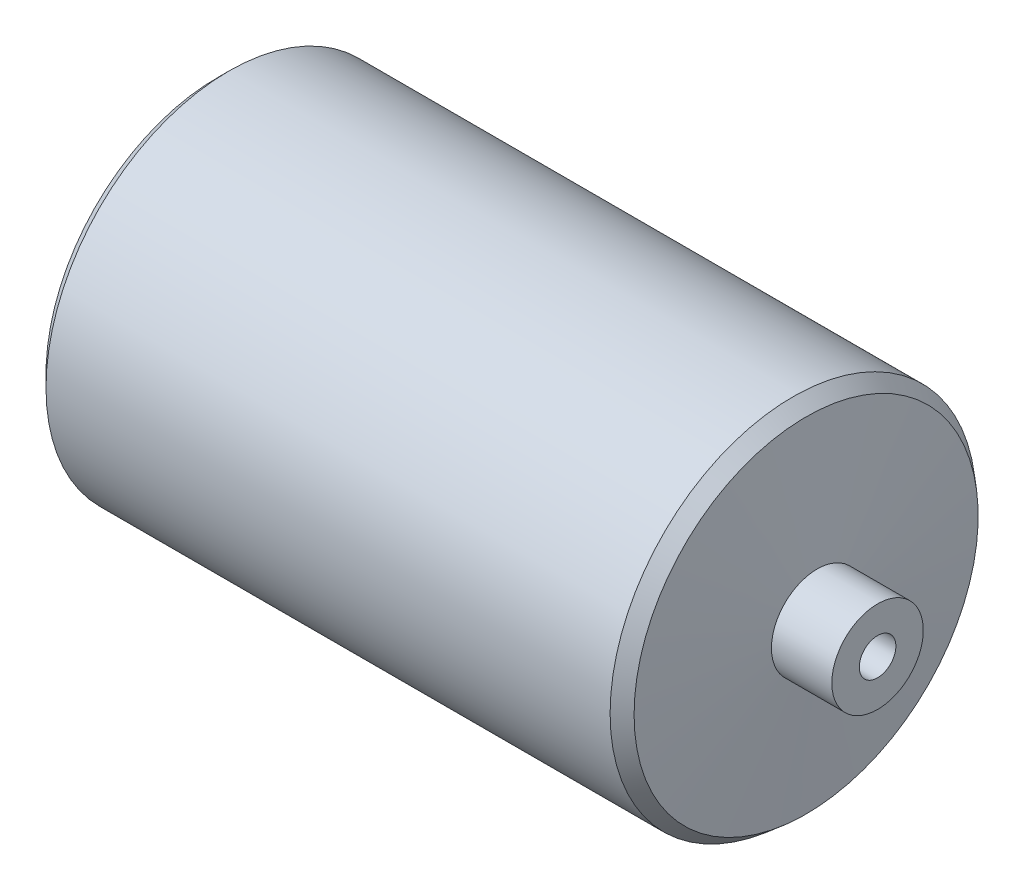
ISO-10303-21;
HEADER;
FILE_DESCRIPTION(('STEP AP214'),'2;1');
FILE_NAME('part.step','',(''),(''),'','','');
FILE_SCHEMA(('AUTOMOTIVE_DESIGN { 1 0 10303 214 1 1 1 1 }'));
ENDSEC;
DATA;
#1=APPLICATION_CONTEXT('core data for automotive mechanical design processes');
#2=APPLICATION_PROTOCOL_DEFINITION('international standard','automotive_design',2000,#1);
#3=PRODUCT_CONTEXT('',#1,'mechanical');
#4=PRODUCT('Part','Part','',(#3));
#5=PRODUCT_RELATED_PRODUCT_CATEGORY('part','',(#4));
#6=PRODUCT_DEFINITION_FORMATION('','',#4);
#7=PRODUCT_DEFINITION_CONTEXT('part definition',#1,'design');
#8=PRODUCT_DEFINITION('design','',#6,#7);
#9=PRODUCT_DEFINITION_SHAPE('','',#8);
#10=(LENGTH_UNIT() NAMED_UNIT(*) SI_UNIT(.MILLI.,.METRE.));
#11=(NAMED_UNIT(*) PLANE_ANGLE_UNIT() SI_UNIT($,.RADIAN.));
#12=(NAMED_UNIT(*) SI_UNIT($,.STERADIAN.) SOLID_ANGLE_UNIT());
#13=UNCERTAINTY_MEASURE_WITH_UNIT(LENGTH_MEASURE(1.E-05),#10,'distance_accuracy_value','');
#14=(GEOMETRIC_REPRESENTATION_CONTEXT(3) GLOBAL_UNCERTAINTY_ASSIGNED_CONTEXT((#13)) GLOBAL_UNIT_ASSIGNED_CONTEXT((#10,
#11,#12)) REPRESENTATION_CONTEXT('',''));
#15=CARTESIAN_POINT('',(0.,0.,0.));
#16=DIRECTION('',(0.,0.,1.));
#17=DIRECTION('',(1.,0.,0.));
#18=AXIS2_PLACEMENT_3D('',#15,#16,#17);
#19=CARTESIAN_POINT('',(-96.0960960960961,40.8408408408408,0.));
#20=DIRECTION('',(1.,0.,0.));
#21=DIRECTION('',(0.,0.,-1.));
#22=AXIS2_PLACEMENT_3D('',#19,#20,#21);
#23=PLANE('',#22);
#24=CARTESIAN_POINT('',(-96.0960960960961,28.3408408408408,0.));
#25=DIRECTION('',(-1.,0.,0.));
#26=DIRECTION('',(0.,0.,1.));
#27=AXIS2_PLACEMENT_3D('',#24,#25,#26);
#28=CIRCLE('',#27,4.99999999999999);
#29=CARTESIAN_POINT('',(-96.0960960960961,28.3408408408408,4.99999999999999));
#30=VERTEX_POINT('',#29);
#31=EDGE_CURVE('E71',#30,#30,#28,.T.);
#32=ORIENTED_EDGE('',*,*,#31,.F.);
#33=EDGE_LOOP('',(#32));
#34=FACE_BOUND('',#33,.T.);
#35=CARTESIAN_POINT('',(-96.0960960960961,28.3408408408408,0.));
#36=DIRECTION('',(-1.,0.,0.));
#37=DIRECTION('',(0.,0.,1.));
#38=AXIS2_PLACEMENT_3D('',#35,#36,#37);
#39=CIRCLE('',#38,12.5);
#40=CARTESIAN_POINT('',(-96.0960960960961,28.3408408408408,12.5));
#41=VERTEX_POINT('',#40);
#42=EDGE_CURVE('E81',#41,#41,#39,.T.);
#43=ORIENTED_EDGE('',*,*,#42,.T.);
#44=EDGE_LOOP('',(#43));
#45=FACE_BOUND('',#44,.T.);
#46=ADVANCED_FACE('F45',(#34,#45),#23,.F.);
#47=CARTESIAN_POINT('',(103.903903903904,28.3408408408408,0.));
#48=DIRECTION('',(-1.,0.,0.));
#49=DIRECTION('',(0.,0.,1.));
#50=AXIS2_PLACEMENT_3D('',#47,#48,#49);
#51=PLANE('',#50);
#52=CARTESIAN_POINT('',(103.903903903904,28.3408408408408,0.));
#53=DIRECTION('',(1.,0.,0.));
#54=DIRECTION('',(0.,0.,-1.));
#55=AXIS2_PLACEMENT_3D('',#52,#53,#54);
#56=CIRCLE('',#55,4.99999999999999);
#57=CARTESIAN_POINT('',(103.903903903904,28.3408408408408,-4.99999999999999));
#58=VERTEX_POINT('',#57);
#59=EDGE_CURVE('E70',#58,#58,#56,.T.);
#60=ORIENTED_EDGE('',*,*,#59,.F.);
#61=EDGE_LOOP('',(#60));
#62=FACE_BOUND('',#61,.T.);
#63=CARTESIAN_POINT('',(103.903903903904,28.3408408408408,0.));
#64=DIRECTION('',(-1.,0.,0.));
#65=DIRECTION('',(0.,0.,1.));
#66=AXIS2_PLACEMENT_3D('',#63,#64,#65);
#67=CIRCLE('',#66,12.5);
#68=CARTESIAN_POINT('',(103.903903903904,28.3408408408408,12.5));
#69=VERTEX_POINT('',#68);
#70=EDGE_CURVE('E90',#69,#69,#67,.T.);
#71=ORIENTED_EDGE('',*,*,#70,.F.);
#72=EDGE_LOOP('',(#71));
#73=FACE_BOUND('',#72,.T.);
#74=ADVANCED_FACE('F137',(#62,#73),#51,.F.);
#75=CARTESIAN_POINT('',(-96.0960960960961,28.3408408408408,0.));
#76=DIRECTION('',(-1.,0.,0.));
#77=DIRECTION('',(0.,0.,1.));
#78=AXIS2_PLACEMENT_3D('',#75,#76,#77);
#79=CYLINDRICAL_SURFACE('',#78,12.5);
#80=CARTESIAN_POINT('',(87.4039039039039,28.3408408408408,0.));
#81=DIRECTION('',(-1.,0.,0.));
#82=DIRECTION('',(0.,0.,1.));
#83=AXIS2_PLACEMENT_3D('',#80,#81,#82);
#84=CIRCLE('',#83,12.5);
#85=CARTESIAN_POINT('',(87.4039039039039,28.3408408408408,12.4999999999999));
#86=VERTEX_POINT('',#85);
#87=EDGE_CURVE('E87',#86,#86,#84,.T.);
#88=ORIENTED_EDGE('',*,*,#87,.F.);
#89=EDGE_LOOP('',(#88));
#90=FACE_BOUND('',#89,.T.);
#91=ORIENTED_EDGE('',*,*,#70,.T.);
#92=EDGE_LOOP('',(#91));
#93=FACE_BOUND('',#92,.T.);
#94=ADVANCED_FACE('F144',(#90,#93),#79,.T.);
#95=CARTESIAN_POINT('',(87.4039039039039,28.3408408408408,0.));
#96=DIRECTION('',(-1.,0.,0.));
#97=DIRECTION('',(0.,0.,1.));
#98=AXIS2_PLACEMENT_3D('',#95,#96,#97);
#99=CONICAL_SURFACE('',#98,12.5,1.48352986419518);
#100=CARTESIAN_POINT('',(84.3845462499247,28.3408408408408,0.));
#101=DIRECTION('',(1.,0.,0.));
#102=DIRECTION('',(0.,0.,-1.));
#103=AXIS2_PLACEMENT_3D('',#100,#101,#102);
#104=CIRCLE('',#103,47.0114159057247);
#105=CARTESIAN_POINT('',(84.3845462499247,28.3408408408408,47.0114159057248));
#106=VERTEX_POINT('',#105);
#107=EDGE_CURVE('E54',#106,#106,#104,.T.);
#108=CARTESIAN_POINT('',(84.3845462499247,28.3408408408408,47.0114159057248));
#109=CARTESIAN_POINT('',(84.4159978921536,28.3408408408408,46.6519219900402));
#110=CARTESIAN_POINT('',(84.4474495343826,28.3408408408408,46.2924280743556));
#111=CARTESIAN_POINT('',(84.5103528188405,28.3408408408408,45.5734402429863));
#112=CARTESIAN_POINT('',(84.5418044610694,28.3408408408408,45.2139463273017));
#113=CARTESIAN_POINT('',(84.6047077455273,28.3408408408408,44.4949584959324));
#114=CARTESIAN_POINT('',(84.6361593877563,28.3408408408408,44.1354645802478));
#115=CARTESIAN_POINT('',(84.6990626722142,28.3408408408408,43.4164767488785));
#116=CARTESIAN_POINT('',(84.7305143144431,28.3408408408408,43.0569828331939));
#117=CARTESIAN_POINT('',(84.793417598901,28.3408408408408,42.3379950018246));
#118=CARTESIAN_POINT('',(84.82486924113,28.3408408408408,41.97850108614));
#119=CARTESIAN_POINT('',(84.8877725255879,28.3408408408408,41.2595132547707));
#120=CARTESIAN_POINT('',(84.9192241678169,28.3408408408408,40.9000193390861));
#121=CARTESIAN_POINT('',(84.9821274522748,28.3408408408408,40.1810315077168));
#122=CARTESIAN_POINT('',(85.0135790945037,28.3408408408408,39.8215375920322));
#123=CARTESIAN_POINT('',(85.0764823789616,28.3408408408408,39.1025497606629));
#124=CARTESIAN_POINT('',(85.1079340211905,28.3408408408408,38.7430558449783));
#125=CARTESIAN_POINT('',(85.1708373056484,28.3408408408408,38.024068013609));
#126=CARTESIAN_POINT('',(85.2022889478774,28.3408408408408,37.6645740979244));
#127=CARTESIAN_POINT('',(85.2651922323353,28.3408408408408,36.9455862665551));
#128=CARTESIAN_POINT('',(85.2966438745642,28.3408408408408,36.5860923508705));
#129=CARTESIAN_POINT('',(85.3595471590222,28.3408408408408,35.8671045195012));
#130=CARTESIAN_POINT('',(85.3909988012511,28.3408408408408,35.5076106038165));
#131=CARTESIAN_POINT('',(85.453902085709,28.3408408408408,34.7886227724473));
#132=CARTESIAN_POINT('',(85.4853537279379,28.3408408408408,34.4291288567626));
#133=CARTESIAN_POINT('',(85.5482570123959,28.3408408408408,33.7101410253934));
#134=CARTESIAN_POINT('',(85.5797086546248,28.3408408408408,33.3506471097087));
#135=CARTESIAN_POINT('',(85.6426119390827,28.3408408408408,32.6316592783395));
#136=CARTESIAN_POINT('',(85.6740635813116,28.3408408408408,32.2721653626548));
#137=CARTESIAN_POINT('',(85.7369668657695,28.3408408408408,31.5531775312856));
#138=CARTESIAN_POINT('',(85.7684185079985,28.3408408408408,31.1936836156009));
#139=CARTESIAN_POINT('',(85.8313217924564,28.3408408408408,30.4746957842317));
#140=CARTESIAN_POINT('',(85.8627734346854,28.3408408408408,30.115201868547));
#141=CARTESIAN_POINT('',(85.9256767191433,28.3408408408408,29.3962140371778));
#142=CARTESIAN_POINT('',(85.9571283613722,28.3408408408408,29.0367201214931));
#143=CARTESIAN_POINT('',(86.0200316458301,28.3408408408408,28.3177322901239));
#144=CARTESIAN_POINT('',(86.0514832880591,28.3408408408408,27.9582383744392));
#145=CARTESIAN_POINT('',(86.114386572517,28.3408408408408,27.23925054307));
#146=CARTESIAN_POINT('',(86.1458382147459,28.3408408408408,26.8797566273853));
#147=CARTESIAN_POINT('',(86.2087414992038,28.3408408408408,26.1607687960161));
#148=CARTESIAN_POINT('',(86.2401931414328,28.3408408408408,25.8012748803314));
#149=CARTESIAN_POINT('',(86.3030964258907,28.3408408408408,25.0822870489621));
#150=CARTESIAN_POINT('',(86.3345480681196,28.3408408408408,24.7227931332775));
#151=CARTESIAN_POINT('',(86.3974513525775,28.3408408408408,24.0038053019082));
#152=CARTESIAN_POINT('',(86.4289029948065,28.3408408408408,23.6443113862236));
#153=CARTESIAN_POINT('',(86.4918062792644,28.3408408408408,22.9253235548543));
#154=CARTESIAN_POINT('',(86.5232579214933,28.3408408408408,22.5658296391697));
#155=CARTESIAN_POINT('',(86.5861612059512,28.3408408408408,21.8468418078004));
#156=CARTESIAN_POINT('',(86.6176128481802,28.3408408408408,21.4873478921158));
#157=CARTESIAN_POINT('',(86.6805161326381,28.3408408408408,20.7683600607465));
#158=CARTESIAN_POINT('',(86.711967774867,28.3408408408408,20.4088661450619));
#159=CARTESIAN_POINT('',(86.7748710593249,28.3408408408408,19.6898783136926));
#160=CARTESIAN_POINT('',(86.8063227015539,28.3408408408408,19.330384398008));
#161=CARTESIAN_POINT('',(86.8692259860118,28.3408408408408,18.6113965666387));
#162=CARTESIAN_POINT('',(86.9006776282407,28.3408408408408,18.2519026509541));
#163=CARTESIAN_POINT('',(86.9635809126986,28.3408408408408,17.5329148195848));
#164=CARTESIAN_POINT('',(86.9950325549276,28.3408408408408,17.1734209039002));
#165=CARTESIAN_POINT('',(87.0579358393855,28.3408408408408,16.4544330725309));
#166=CARTESIAN_POINT('',(87.0893874816144,28.3408408408408,16.0949391568463));
#167=CARTESIAN_POINT('',(87.1522907660723,28.3408408408408,15.375951325477));
#168=CARTESIAN_POINT('',(87.1837424083013,28.3408408408408,15.0164574097924));
#169=CARTESIAN_POINT('',(87.2466456927592,28.3408408408408,14.2974695784231));
#170=CARTESIAN_POINT('',(87.2780973349881,28.3408408408408,13.9379756627385));
#171=CARTESIAN_POINT('',(87.341000619446,28.3408408408408,13.2189878313692));
#172=CARTESIAN_POINT('',(87.372452261675,28.3408408408408,12.8594939156846));
#173=CARTESIAN_POINT('',(87.4039039039039,28.3408408408408,12.4999999999999));
#174=B_SPLINE_CURVE_WITH_KNOTS('',3,(#108,#109,#110,#111,#112,#113,#114,#115,#116,#117,#118,
#119,#120,#121,#122,#123,#124,#125,#126,#127,#128,#129,#130,#131,#132,#133,#134,#135,#136,#137,
#138,#139,#140,#141,#142,#143,#144,#145,#146,#147,#148,#149,#150,#151,#152,#153,#154,#155,#156,
#157,#158,#159,#160,#161,#162,#163,#164,#165,#166,#167,#168,#169,#170,#171,#172,#173),
.UNSPECIFIED.,.F.,.F.,(4,2,2,2,2,2,2,2,2,2,2,2,2,2,2,2,2,2,2,2,2,2,2,2,2,2,2,2,2,2,2,2,4),(0.,
1.08260137212111,2.16520274424222,3.24780411636334,4.33040548848446,5.41300686060557,
6.49560823272669,7.5782096048478,8.66081097696891,9.74341234909003,10.8260137212111,
11.9086150933323,12.9912164654534,14.0738178375745,15.1564192096956,16.2390205818167,
17.3216219539378,18.4042233260589,19.4868246981801,20.5694260703012,21.6520274424223,
22.7346288145434,23.8172301866645,24.8998315587856,25.9824329309068,27.0650343030279,
28.147635675149,29.2302370472701,30.3128384193912,31.3954397915123,32.4780411636334,
33.5606425357546,34.6432439078757),.UNSPECIFIED.);
#175=EDGE_CURVE('BSEAM101',#106,#86,#174,.T.);
#176=ORIENTED_EDGE('',*,*,#107,.T.);
#177=ORIENTED_EDGE('',*,*,#87,.T.);
#178=ORIENTED_EDGE('',*,*,#175,.T.);
#179=ORIENTED_EDGE('',*,*,#175,.F.);
#180=EDGE_LOOP('',(#176,#178,#177,#179));
#181=FACE_BOUND('',#180,.T.);
#182=ADVANCED_FACE('F101',(#181),#99,.T.);
#183=CARTESIAN_POINT('',(-96.0960960960961,28.3408408408408,0.));
#184=DIRECTION('',(-1.,0.,0.));
#185=DIRECTION('',(0.,0.,1.));
#186=AXIS2_PLACEMENT_3D('',#183,#184,#185);
#187=CYLINDRICAL_SURFACE('',#186,50.);
#188=CARTESIAN_POINT('',(80.8228904188022,28.3408408408408,0.));
#189=DIRECTION('',(-1.,0.,0.));
#190=DIRECTION('',(0.,0.,1.));
#191=AXIS2_PLACEMENT_3D('',#188,#189,#190);
#192=CIRCLE('',#191,50.);
#193=CARTESIAN_POINT('',(80.8228904188022,28.3408408408408,50.));
#194=VERTEX_POINT('',#193);
#195=EDGE_CURVE('E96',#194,#194,#192,.T.);
#196=ORIENTED_EDGE('',*,*,#195,.T.);
#197=EDGE_LOOP('',(#196));
#198=FACE_BOUND('',#197,.T.);
#199=CARTESIAN_POINT('',(-73.3152712138738,28.3408408408408,0.));
#200=DIRECTION('',(1.,0.,0.));
#201=DIRECTION('',(0.,0.,-1.));
#202=AXIS2_PLACEMENT_3D('',#199,#200,#201);
#203=CIRCLE('',#202,50.);
#204=CARTESIAN_POINT('',(-73.3152712138738,28.3408408408408,-50.));
#205=VERTEX_POINT('',#204);
#206=EDGE_CURVE('E93',#205,#205,#203,.T.);
#207=ORIENTED_EDGE('',*,*,#206,.T.);
#208=EDGE_LOOP('',(#207));
#209=FACE_BOUND('',#208,.T.);
#210=ADVANCED_FACE('F110',(#198,#209),#187,.T.);
#211=CARTESIAN_POINT('',(-76.3152712138738,28.3408408408408,0.));
#212=DIRECTION('',(1.,0.,0.));
#213=DIRECTION('',(0.,0.,-1.));
#214=AXIS2_PLACEMENT_3D('',#211,#212,#213);
#215=CONICAL_SURFACE('',#214,50.,1.48352986419518);
#216=CARTESIAN_POINT('',(-76.6029016027651,28.3408408408408,0.));
#217=DIRECTION('',(-1.,0.,0.));
#218=DIRECTION('',(0.,0.,1.));
#219=AXIS2_PLACEMENT_3D('',#216,#217,#218);
#220=CIRCLE('',#219,46.7123696111087);
#221=CARTESIAN_POINT('',(-76.6029016027651,28.3408408408408,-46.7123696111087));
#222=VERTEX_POINT('',#221);
#223=EDGE_CURVE('E11',#222,#222,#220,.T.);
#224=CARTESIAN_POINT('',(-79.5960960960961,28.3408408408408,0.));
#225=DIRECTION('',(-1.,0.,0.));
#226=DIRECTION('',(0.,0.,1.));
#227=AXIS2_PLACEMENT_3D('',#224,#225,#226);
#228=CIRCLE('',#227,12.5);
#229=CARTESIAN_POINT('',(-79.5960960960961,28.3408408408408,-12.5000000000001));
#230=VERTEX_POINT('',#229);
#231=EDGE_CURVE('E84',#230,#230,#228,.T.);
#232=CARTESIAN_POINT('',(-76.6029016027651,28.3408408408408,-46.7123696111087));
#233=CARTESIAN_POINT('',(-76.6340807120706,28.3408408408408,-46.355990760993));
#234=CARTESIAN_POINT('',(-76.6652598213762,28.3408408408408,-45.9996119108773));
#235=CARTESIAN_POINT('',(-76.7276180399872,28.3408408408408,-45.2868542106458));
#236=CARTESIAN_POINT('',(-76.7587971492928,28.3408408408408,-44.9304753605301));
#237=CARTESIAN_POINT('',(-76.8211553679038,28.3408408408408,-44.2177176602987));
#238=CARTESIAN_POINT('',(-76.8523344772094,28.3408408408408,-43.861338810183));
#239=CARTESIAN_POINT('',(-76.9146926958204,28.3408408408408,-43.1485811099516));
#240=CARTESIAN_POINT('',(-76.9458718051259,28.3408408408408,-42.7922022598358));
#241=CARTESIAN_POINT('',(-77.008230023737,28.3408408408408,-42.0794445596044));
#242=CARTESIAN_POINT('',(-77.0394091330425,28.3408408408408,-41.7230657094887));
#243=CARTESIAN_POINT('',(-77.1017673516536,28.3408408408408,-41.0103080092573));
#244=CARTESIAN_POINT('',(-77.1329464609591,28.3408408408408,-40.6539291591416));
#245=CARTESIAN_POINT('',(-77.1953046795702,28.3408408408408,-39.9411714589101));
#246=CARTESIAN_POINT('',(-77.2264837888757,28.3408408408408,-39.5847926087944));
#247=CARTESIAN_POINT('',(-77.2888420074868,28.3408408408408,-38.872034908563));
#248=CARTESIAN_POINT('',(-77.3200211167923,28.3408408408408,-38.5156560584473));
#249=CARTESIAN_POINT('',(-77.3823793354034,28.3408408408408,-37.8028983582158));
#250=CARTESIAN_POINT('',(-77.4135584447089,28.3408408408408,-37.4465195081001));
#251=CARTESIAN_POINT('',(-77.47591666332,28.3408408408408,-36.7337618078687));
#252=CARTESIAN_POINT('',(-77.5070957726255,28.3408408408408,-36.377382957753));
#253=CARTESIAN_POINT('',(-77.5694539912366,28.3408408408408,-35.6646252575216));
#254=CARTESIAN_POINT('',(-77.6006331005421,28.3408408408408,-35.3082464074058));
#255=CARTESIAN_POINT('',(-77.6629913191532,28.3408408408408,-34.5954887071744));
#256=CARTESIAN_POINT('',(-77.6941704284587,28.3408408408408,-34.2391098570587));
#257=CARTESIAN_POINT('',(-77.7565286470698,28.3408408408408,-33.5263521568273));
#258=CARTESIAN_POINT('',(-77.7877077563753,28.3408408408408,-33.1699733067115));
#259=CARTESIAN_POINT('',(-77.8500659749863,28.3408408408408,-32.4572156064801));
#260=CARTESIAN_POINT('',(-77.8812450842919,28.3408408408408,-32.1008367563644));
#261=CARTESIAN_POINT('',(-77.9436033029029,28.3408408408408,-31.388079056133));
#262=CARTESIAN_POINT('',(-77.9747824122085,28.3408408408408,-31.0317002060173));
#263=CARTESIAN_POINT('',(-78.0371406308195,28.3408408408408,-30.3189425057858));
#264=CARTESIAN_POINT('',(-78.0683197401251,28.3408408408408,-29.9625636556701));
#265=CARTESIAN_POINT('',(-78.1306779587361,28.3408408408408,-29.2498059554387));
#266=CARTESIAN_POINT('',(-78.1618570680417,28.3408408408408,-28.893427105323));
#267=CARTESIAN_POINT('',(-78.2242152866527,28.3408408408408,-28.1806694050915));
#268=CARTESIAN_POINT('',(-78.2553943959582,28.3408408408408,-27.8242905549758));
#269=CARTESIAN_POINT('',(-78.3177526145693,28.3408408408408,-27.1115328547444));
#270=CARTESIAN_POINT('',(-78.3489317238748,28.3408408408408,-26.7551540046287));
#271=CARTESIAN_POINT('',(-78.4112899424859,28.3408408408408,-26.0423963043973));
#272=CARTESIAN_POINT('',(-78.4424690517914,28.3408408408408,-25.6860174542815));
#273=CARTESIAN_POINT('',(-78.5048272704025,28.3408408408408,-24.9732597540501));
#274=CARTESIAN_POINT('',(-78.536006379708,28.3408408408408,-24.6168809039344));
#275=CARTESIAN_POINT('',(-78.5983645983191,28.3408408408408,-23.904123203703));
#276=CARTESIAN_POINT('',(-78.6295437076246,28.3408408408408,-23.5477443535873));
#277=CARTESIAN_POINT('',(-78.6919019262357,28.3408408408408,-22.8349866533558));
#278=CARTESIAN_POINT('',(-78.7230810355412,28.3408408408408,-22.4786078032401));
#279=CARTESIAN_POINT('',(-78.7854392541523,28.3408408408408,-21.7658501030087));
#280=CARTESIAN_POINT('',(-78.8166183634578,28.3408408408408,-21.409471252893));
#281=CARTESIAN_POINT('',(-78.8789765820689,28.3408408408408,-20.6967135526615));
#282=CARTESIAN_POINT('',(-78.9101556913744,28.3408408408408,-20.3403347025458));
#283=CARTESIAN_POINT('',(-78.9725139099855,28.3408408408408,-19.6275770023144));
#284=CARTESIAN_POINT('',(-79.003693019291,28.3408408408408,-19.2711981521987));
#285=CARTESIAN_POINT('',(-79.066051237902,28.3408408408408,-18.5584404519673));
#286=CARTESIAN_POINT('',(-79.0972303472076,28.3408408408408,-18.2020616018515));
#287=CARTESIAN_POINT('',(-79.1595885658187,28.3408408408408,-17.4893039016201));
#288=CARTESIAN_POINT('',(-79.1907676751242,28.3408408408408,-17.1329250515044));
#289=CARTESIAN_POINT('',(-79.2531258937352,28.3408408408408,-16.420167351273));
#290=CARTESIAN_POINT('',(-79.2843050030408,28.3408408408408,-16.0637885011573));
#291=CARTESIAN_POINT('',(-79.3466632216518,28.3408408408408,-15.3510308009258));
#292=CARTESIAN_POINT('',(-79.3778423309574,28.3408408408408,-14.9946519508101));
#293=CARTESIAN_POINT('',(-79.4402005495684,28.3408408408408,-14.2818942505787));
#294=CARTESIAN_POINT('',(-79.471379658874,28.3408408408408,-13.925515400463));
#295=CARTESIAN_POINT('',(-79.533737877485,28.3408408408408,-13.2127577002315));
#296=CARTESIAN_POINT('',(-79.5649169867905,28.3408408408408,-12.8563788501158));
#297=CARTESIAN_POINT('',(-79.5960960960961,28.3408408408408,-12.5000000000001));
#298=B_SPLINE_CURVE_WITH_KNOTS('',3,(#232,#233,#234,#235,#236,#237,#238,#239,#240,#241,#242,
#243,#244,#245,#246,#247,#248,#249,#250,#251,#252,#253,#254,#255,#256,#257,#258,#259,#260,#261,
#262,#263,#264,#265,#266,#267,#268,#269,#270,#271,#272,#273,#274,#275,#276,#277,#278,#279,#280,
#281,#282,#283,#284,#285,#286,#287,#288,#289,#290,#291,#292,#293,#294,#295,#296,#297),
.UNSPECIFIED.,.F.,.F.,(4,2,2,2,2,2,2,2,2,2,2,2,2,2,2,2,2,2,2,2,2,2,2,2,2,2,2,2,2,2,2,2,4),(0.,
1.07322047828112,2.14644095656224,3.21966143484337,4.2928819131245,5.36610239140562,
6.43932286968675,7.51254334796787,8.585763826249,9.65898430453012,10.7322047828112,
11.8054252610924,12.8786457393735,13.9518662176546,15.0250866959357,16.0983071742169,
17.171527652498,18.2447481307791,19.3179686090602,20.3911890873414,21.4644095656225,
22.5376300439036,23.6108505221847,24.6840710004659,25.757291478747,26.8305119570281,
27.9037324353093,28.9769529135904,30.0501733918715,31.1233938701526,32.1966143484338,
33.2698348267149,34.343055304996),.UNSPECIFIED.);
#299=EDGE_CURVE('BSEAM113',#222,#230,#298,.T.);
#300=ORIENTED_EDGE('',*,*,#223,.T.);
#301=ORIENTED_EDGE('',*,*,#231,.F.);
#302=ORIENTED_EDGE('',*,*,#299,.T.);
#303=ORIENTED_EDGE('',*,*,#299,.F.);
#304=EDGE_LOOP('',(#300,#302,#301,#303));
#305=FACE_BOUND('',#304,.T.);
#306=ADVANCED_FACE('F113',(#305),#215,.T.);
#307=CARTESIAN_POINT('',(-96.0960960960961,28.3408408408408,0.));
#308=DIRECTION('',(-1.,0.,0.));
#309=DIRECTION('',(0.,0.,1.));
#310=AXIS2_PLACEMENT_3D('',#307,#308,#309);
#311=CYLINDRICAL_SURFACE('',#310,12.5);
#312=ORIENTED_EDGE('',*,*,#42,.F.);
#313=EDGE_LOOP('',(#312));
#314=FACE_BOUND('',#313,.T.);
#315=ORIENTED_EDGE('',*,*,#231,.T.);
#316=EDGE_LOOP('',(#315));
#317=FACE_BOUND('',#316,.T.);
#318=ADVANCED_FACE('F107',(#314,#317),#311,.T.);
#319=CARTESIAN_POINT('',(80.8228904188022,28.3408408408408,0.));
#320=DIRECTION('',(-1.,0.,0.));
#321=DIRECTION('',(0.,0.,1.));
#322=AXIS2_PLACEMENT_3D('',#319,#320,#321);
#323=CONICAL_SURFACE('',#322,50.,0.698131700797732);
#324=ORIENTED_EDGE('',*,*,#107,.F.);
#325=EDGE_LOOP('',(#324));
#326=FACE_BOUND('',#325,.T.);
#327=ORIENTED_EDGE('',*,*,#195,.F.);
#328=EDGE_LOOP('',(#327));
#329=FACE_BOUND('',#328,.T.);
#330=ADVANCED_FACE('F104',(#326,#329),#323,.T.);
#331=CARTESIAN_POINT('',(-76.6029016027651,28.3408408408408,0.));
#332=DIRECTION('',(1.,0.,0.));
#333=DIRECTION('',(0.,0.,-1.));
#334=AXIS2_PLACEMENT_3D('',#331,#332,#333);
#335=CONICAL_SURFACE('',#334,46.7123696111087,0.785398163397448);
#336=ORIENTED_EDGE('',*,*,#206,.F.);
#337=EDGE_LOOP('',(#336));
#338=FACE_BOUND('',#337,.T.);
#339=ORIENTED_EDGE('',*,*,#223,.F.);
#340=EDGE_LOOP('',(#339));
#341=FACE_BOUND('',#340,.T.);
#342=ADVANCED_FACE('F48',(#338,#341),#335,.T.);
#343=CARTESIAN_POINT('',(44.9039039039039,28.3408408408408,0.));
#344=DIRECTION('',(1.,0.,0.));
#345=DIRECTION('',(0.,0.,-1.));
#346=AXIS2_PLACEMENT_3D('',#343,#344,#345);
#347=CONICAL_SURFACE('',#346,4.99999999999998,1.02974425867665);
#348=CARTESIAN_POINT('',(41.8996008087661,28.3408408408408,0.));
#349=VERTEX_POINT('',#348);
#350=VERTEX_LOOP('',#349);
#351=FACE_BOUND('',#350,.T.);
#352=CARTESIAN_POINT('',(44.9039039039039,28.3408408408408,0.));
#353=DIRECTION('',(1.,0.,0.));
#354=DIRECTION('',(0.,0.,-1.));
#355=AXIS2_PLACEMENT_3D('',#352,#353,#354);
#356=CIRCLE('',#355,4.99999999999998);
#357=CARTESIAN_POINT('',(44.9039039039039,28.3408408408408,-4.99999999999998));
#358=VERTEX_POINT('',#357);
#359=EDGE_CURVE('E74',#358,#358,#356,.T.);
#360=ORIENTED_EDGE('',*,*,#359,.T.);
#361=EDGE_LOOP('',(#360));
#362=FACE_BOUND('',#361,.T.);
#363=ADVANCED_FACE('F119',(#351,#362),#347,.F.);
#364=CARTESIAN_POINT('',(103.903903903904,28.3408408408408,0.));
#365=DIRECTION('',(1.,0.,0.));
#366=DIRECTION('',(0.,0.,-1.));
#367=AXIS2_PLACEMENT_3D('',#364,#365,#366);
#368=CYLINDRICAL_SURFACE('',#367,4.99999999999999);
#369=ORIENTED_EDGE('',*,*,#359,.F.);
#370=EDGE_LOOP('',(#369));
#371=FACE_BOUND('',#370,.T.);
#372=ORIENTED_EDGE('',*,*,#59,.T.);
#373=EDGE_LOOP('',(#372));
#374=FACE_BOUND('',#373,.T.);
#375=ADVANCED_FACE('F64',(#371,#374),#368,.F.);
#376=CARTESIAN_POINT('',(-37.0960960960961,28.3408408408408,0.));
#377=DIRECTION('',(-1.,0.,0.));
#378=DIRECTION('',(0.,0.,1.));
#379=AXIS2_PLACEMENT_3D('',#376,#377,#378);
#380=CONICAL_SURFACE('',#379,4.99999999999998,1.02974425867665);
#381=CARTESIAN_POINT('',(-34.0917930009583,28.3408408408408,0.));
#382=VERTEX_POINT('',#381);
#383=VERTEX_LOOP('',#382);
#384=FACE_BOUND('',#383,.T.);
#385=CARTESIAN_POINT('',(-37.0960960960961,28.3408408408408,0.));
#386=DIRECTION('',(-1.,0.,0.));
#387=DIRECTION('',(0.,0.,1.));
#388=AXIS2_PLACEMENT_3D('',#385,#386,#387);
#389=CIRCLE('',#388,4.99999999999998);
#390=CARTESIAN_POINT('',(-37.0960960960961,28.3408408408408,4.99999999999998));
#391=VERTEX_POINT('',#390);
#392=EDGE_CURVE('E68',#391,#391,#389,.T.);
#393=ORIENTED_EDGE('',*,*,#392,.T.);
#394=EDGE_LOOP('',(#393));
#395=FACE_BOUND('',#394,.T.);
#396=ADVANCED_FACE('F60',(#384,#395),#380,.F.);
#397=CARTESIAN_POINT('',(-96.0960960960961,28.3408408408408,0.));
#398=DIRECTION('',(-1.,0.,0.));
#399=DIRECTION('',(0.,0.,1.));
#400=AXIS2_PLACEMENT_3D('',#397,#398,#399);
#401=CYLINDRICAL_SURFACE('',#400,4.99999999999999);
#402=ORIENTED_EDGE('',*,*,#392,.F.);
#403=EDGE_LOOP('',(#402));
#404=FACE_BOUND('',#403,.T.);
#405=ORIENTED_EDGE('',*,*,#31,.T.);
#406=EDGE_LOOP('',(#405));
#407=FACE_BOUND('',#406,.T.);
#408=ADVANCED_FACE('F63',(#404,#407),#401,.F.);
#409=CLOSED_SHELL('',(#46,#74,#94,#182,#210,#306,#318,#330,#342,#363,#375,#396,#408));
#410=MANIFOLD_SOLID_BREP('B2',#409);
#411=ADVANCED_BREP_SHAPE_REPRESENTATION('',(#18,#410),#14);
#412=SHAPE_DEFINITION_REPRESENTATION(#9,#411);
ENDSEC;
END-ISO-10303-21;
